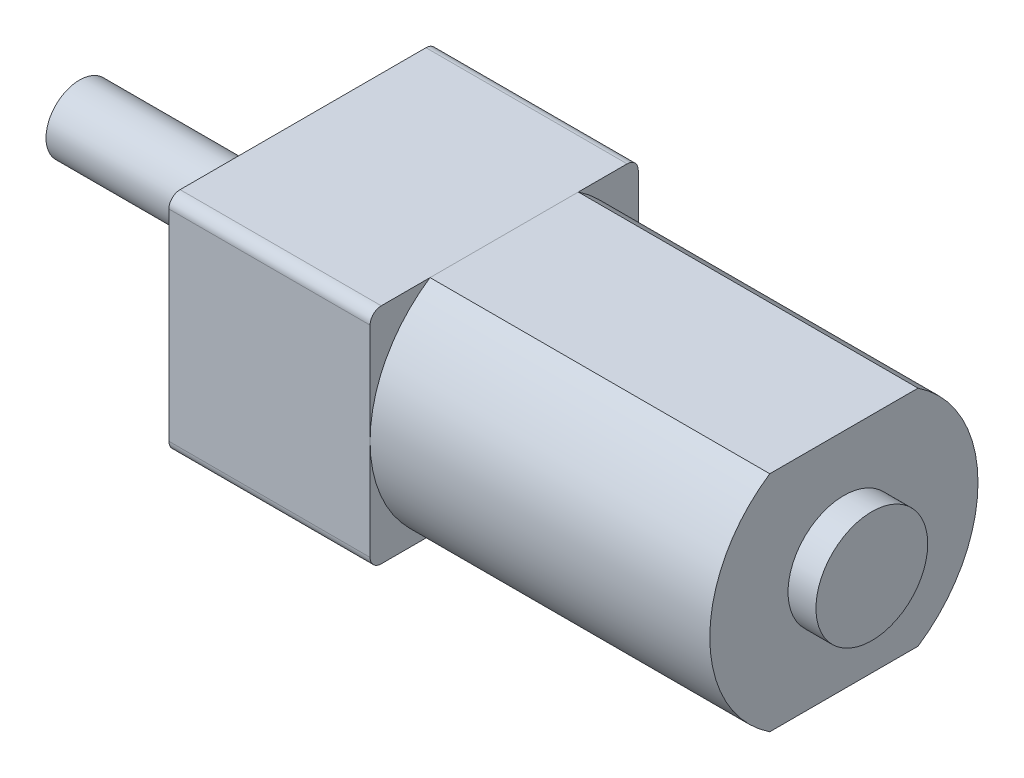
ISO-10303-21;
HEADER;
FILE_DESCRIPTION(('STEP AP214'),'2;1');
FILE_NAME('part.step','',(''),(''),'','','');
FILE_SCHEMA(('AUTOMOTIVE_DESIGN { 1 0 10303 214 1 1 1 1 }'));
ENDSEC;
DATA;
#1=APPLICATION_CONTEXT('core data for automotive mechanical design processes');
#2=APPLICATION_PROTOCOL_DEFINITION('international standard','automotive_design',2000,#1);
#3=PRODUCT_CONTEXT('',#1,'mechanical');
#4=PRODUCT('Part','Part','',(#3));
#5=PRODUCT_RELATED_PRODUCT_CATEGORY('part','',(#4));
#6=PRODUCT_DEFINITION_FORMATION('','',#4);
#7=PRODUCT_DEFINITION_CONTEXT('part definition',#1,'design');
#8=PRODUCT_DEFINITION('design','',#6,#7);
#9=PRODUCT_DEFINITION_SHAPE('','',#8);
#10=(LENGTH_UNIT() NAMED_UNIT(*) SI_UNIT(.MILLI.,.METRE.));
#11=(NAMED_UNIT(*) PLANE_ANGLE_UNIT() SI_UNIT($,.RADIAN.));
#12=(NAMED_UNIT(*) SI_UNIT($,.STERADIAN.) SOLID_ANGLE_UNIT());
#13=UNCERTAINTY_MEASURE_WITH_UNIT(LENGTH_MEASURE(1.E-05),#10,'distance_accuracy_value','');
#14=(GEOMETRIC_REPRESENTATION_CONTEXT(3) GLOBAL_UNCERTAINTY_ASSIGNED_CONTEXT((#13)) GLOBAL_UNIT_ASSIGNED_CONTEXT((#10,
#11,#12)) REPRESENTATION_CONTEXT('',''));
#15=CARTESIAN_POINT('',(0.,0.,0.));
#16=DIRECTION('',(0.,0.,1.));
#17=DIRECTION('',(1.,0.,0.));
#18=AXIS2_PLACEMENT_3D('',#15,#16,#17);
#19=CARTESIAN_POINT('',(-19.,0.,0.));
#20=DIRECTION('',(1.,0.,0.));
#21=DIRECTION('',(0.,0.,-1.));
#22=AXIS2_PLACEMENT_3D('',#19,#20,#21);
#23=CYLINDRICAL_SURFACE('',#22,1.5);
#24=CARTESIAN_POINT('',(-9.7,0.,0.));
#25=DIRECTION('',(-1.,0.,0.));
#26=DIRECTION('',(0.,0.,1.));
#27=AXIS2_PLACEMENT_3D('',#24,#25,#26);
#28=CIRCLE('',#27,1.5);
#29=CARTESIAN_POINT('',(-9.7,-1.,1.11803398874989));
#30=VERTEX_POINT('',#29);
#31=CARTESIAN_POINT('',(-9.7,-1.,-1.11803398874989));
#32=VERTEX_POINT('',#31);
#33=EDGE_CURVE('E74',#30,#32,#28,.T.);
#34=ORIENTED_EDGE('',*,*,#33,.T.);
#35=DIRECTION('',(1.,0.,0.));
#36=VECTOR('',#35,1.);
#37=CARTESIAN_POINT('',(-19.,-1.,-1.11803398874989));
#38=LINE('',#37,#36);
#39=CARTESIAN_POINT('',(-19.,-1.,-1.11803398874989));
#40=VERTEX_POINT('',#39);
#41=EDGE_CURVE('E12',#40,#32,#38,.T.);
#42=ORIENTED_EDGE('',*,*,#41,.F.);
#43=CARTESIAN_POINT('',(-19.,0.,0.));
#44=DIRECTION('',(-1.,0.,0.));
#45=DIRECTION('',(0.,0.,1.));
#46=AXIS2_PLACEMENT_3D('',#43,#44,#45);
#47=CIRCLE('',#46,1.5);
#48=CARTESIAN_POINT('',(-19.,-1.,1.11803398874989));
#49=VERTEX_POINT('',#48);
#50=EDGE_CURVE('E73',#49,#40,#47,.T.);
#51=ORIENTED_EDGE('',*,*,#50,.F.);
#52=DIRECTION('',(1.,0.,0.));
#53=VECTOR('',#52,1.);
#54=CARTESIAN_POINT('',(-19.,-1.,1.11803398874989));
#55=LINE('',#54,#53);
#56=EDGE_CURVE('E51',#49,#30,#55,.T.);
#57=ORIENTED_EDGE('',*,*,#56,.T.);
#58=EDGE_LOOP('',(#34,#42,#51,#57));
#59=FACE_BOUND('',#58,.T.);
#60=ADVANCED_FACE('F43',(#59),#23,.T.);
#61=CARTESIAN_POINT('',(-19.,-1.,-1.11803398874989));
#62=DIRECTION('',(0.,1.,0.));
#63=DIRECTION('',(0.,0.,1.));
#64=AXIS2_PLACEMENT_3D('',#61,#62,#63);
#65=PLANE('',#64);
#66=DIRECTION('',(0.,0.,1.));
#67=VECTOR('',#66,1.);
#68=CARTESIAN_POINT('',(-9.7,-1.,-1.11803398874989));
#69=LINE('',#68,#67);
#70=EDGE_CURVE('E66',#32,#30,#69,.T.);
#71=ORIENTED_EDGE('',*,*,#70,.T.);
#72=ORIENTED_EDGE('',*,*,#56,.F.);
#73=DIRECTION('',(0.,0.,1.));
#74=VECTOR('',#73,1.);
#75=CARTESIAN_POINT('',(-19.,-1.,-1.11803398874989));
#76=LINE('',#75,#74);
#77=EDGE_CURVE('E58',#40,#49,#76,.T.);
#78=ORIENTED_EDGE('',*,*,#77,.F.);
#79=ORIENTED_EDGE('',*,*,#41,.T.);
#80=EDGE_LOOP('',(#71,#72,#78,#79));
#81=FACE_BOUND('',#80,.T.);
#82=ADVANCED_FACE('F69',(#81),#65,.F.);
#83=CARTESIAN_POINT('',(-19.,0.,0.));
#84=DIRECTION('',(-1.,0.,0.));
#85=DIRECTION('',(0.,0.,1.));
#86=AXIS2_PLACEMENT_3D('',#83,#84,#85);
#87=PLANE('',#86);
#88=ORIENTED_EDGE('',*,*,#50,.T.);
#89=ORIENTED_EDGE('',*,*,#77,.T.);
#90=EDGE_LOOP('',(#88,#89));
#91=FACE_BOUND('',#90,.T.);
#92=ADVANCED_FACE('F81',(#91),#87,.T.);
#93=CARTESIAN_POINT('',(-9.7,0.,0.));
#94=DIRECTION('',(-1.,0.,0.));
#95=DIRECTION('',(0.,0.,1.));
#96=AXIS2_PLACEMENT_3D('',#93,#94,#95);
#97=PLANE('',#96);
#98=ORIENTED_EDGE('',*,*,#33,.F.);
#99=ORIENTED_EDGE('',*,*,#70,.F.);
#100=EDGE_LOOP('',(#98,#99));
#101=FACE_BOUND('',#100,.T.);
#102=ADVANCED_FACE('F77',(#101),#97,.F.);
#103=CLOSED_SHELL('',(#60,#82,#92,#102));
#104=MANIFOLD_SOLID_BREP('B2',#103);
#105=CARTESIAN_POINT('',(-9.7,0.,0.));
#106=DIRECTION('',(1.,0.,0.));
#107=DIRECTION('',(0.,0.,-1.));
#108=AXIS2_PLACEMENT_3D('',#105,#106,#107);
#109=CYLINDRICAL_SURFACE('',#108,2.);
#110=CARTESIAN_POINT('',(-9.7,0.,0.));
#111=DIRECTION('',(-1.,0.,0.));
#112=DIRECTION('',(0.,0.,1.));
#113=AXIS2_PLACEMENT_3D('',#110,#111,#112);
#114=CIRCLE('',#113,2.);
#115=CARTESIAN_POINT('',(-9.7,0.,2.));
#116=VERTEX_POINT('',#115);
#117=EDGE_CURVE('E42',#116,#116,#114,.T.);
#118=ORIENTED_EDGE('',*,*,#117,.F.);
#119=EDGE_LOOP('',(#118));
#120=FACE_BOUND('',#119,.T.);
#121=CARTESIAN_POINT('',(-9.,0.,0.));
#122=DIRECTION('',(-1.,0.,0.));
#123=DIRECTION('',(0.,0.,1.));
#124=AXIS2_PLACEMENT_3D('',#121,#122,#123);
#125=CIRCLE('',#124,2.);
#126=CARTESIAN_POINT('',(-9.,0.,2.));
#127=VERTEX_POINT('',#126);
#128=EDGE_CURVE('E127',#127,#127,#125,.T.);
#129=ORIENTED_EDGE('',*,*,#128,.T.);
#130=EDGE_LOOP('',(#129));
#131=FACE_BOUND('',#130,.T.);
#132=ADVANCED_FACE('F124',(#120,#131),#109,.T.);
#133=CARTESIAN_POINT('',(-9.7,0.,0.));
#134=DIRECTION('',(-1.,0.,0.));
#135=DIRECTION('',(0.,0.,1.));
#136=AXIS2_PLACEMENT_3D('',#133,#134,#135);
#137=PLANE('',#136);
#138=ORIENTED_EDGE('',*,*,#117,.T.);
#139=EDGE_LOOP('',(#138));
#140=FACE_BOUND('',#139,.T.);
#141=ADVANCED_FACE('F139',(#140),#137,.T.);
#142=CARTESIAN_POINT('',(-9.,0.,0.));
#143=DIRECTION('',(-1.,0.,0.));
#144=DIRECTION('',(0.,0.,1.));
#145=AXIS2_PLACEMENT_3D('',#142,#143,#144);
#146=PLANE('',#145);
#147=ORIENTED_EDGE('',*,*,#128,.F.);
#148=EDGE_LOOP('',(#147));
#149=FACE_BOUND('',#148,.T.);
#150=ADVANCED_FACE('F137',(#149),#146,.F.);
#151=CLOSED_SHELL('',(#132,#141,#150));
#152=MANIFOLD_SOLID_BREP('B6',#151);
#153=CARTESIAN_POINT('',(-9.,5.,6.));
#154=DIRECTION('',(0.,0.,-1.));
#155=DIRECTION('',(-1.,0.,0.));
#156=AXIS2_PLACEMENT_3D('',#153,#154,#155);
#157=PLANE('',#156);
#158=DIRECTION('',(0.,1.,0.));
#159=VECTOR('',#158,1.);
#160=CARTESIAN_POINT('',(-9.,5.,6.));
#161=LINE('',#160,#159);
#162=CARTESIAN_POINT('',(-9.,-4.5,6.));
#163=VERTEX_POINT('',#162);
#164=CARTESIAN_POINT('',(-9.,4.5,6.));
#165=VERTEX_POINT('',#164);
#166=EDGE_CURVE('E258',#163,#165,#161,.T.);
#167=ORIENTED_EDGE('',*,*,#166,.F.);
#168=DIRECTION('',(1.,0.,0.));
#169=VECTOR('',#168,1.);
#170=CARTESIAN_POINT('',(-9.,-4.5,6.));
#171=LINE('',#170,#169);
#172=CARTESIAN_POINT('',(0.,-4.5,6.));
#173=VERTEX_POINT('',#172);
#174=EDGE_CURVE('E243',#163,#173,#171,.T.);
#175=ORIENTED_EDGE('',*,*,#174,.T.);
#176=DIRECTION('',(0.,1.,0.));
#177=VECTOR('',#176,1.);
#178=CARTESIAN_POINT('',(0.,5.,6.));
#179=LINE('',#178,#177);
#180=CARTESIAN_POINT('',(0.,4.5,6.));
#181=VERTEX_POINT('',#180);
#182=EDGE_CURVE('E255',#173,#181,#179,.T.);
#183=ORIENTED_EDGE('',*,*,#182,.T.);
#184=DIRECTION('',(1.,0.,0.));
#185=VECTOR('',#184,1.);
#186=CARTESIAN_POINT('',(-9.,4.5,6.));
#187=LINE('',#186,#185);
#188=EDGE_CURVE('E260',#181,#165,#187,.F.);
#189=ORIENTED_EDGE('',*,*,#188,.T.);
#190=EDGE_LOOP('',(#167,#175,#183,#189));
#191=FACE_BOUND('',#190,.T.);
#192=ADVANCED_FACE('F173',(#191),#157,.F.);
#193=CARTESIAN_POINT('',(-9.,5.,-6.));
#194=DIRECTION('',(0.,-1.,0.));
#195=DIRECTION('',(0.,0.,-1.));
#196=AXIS2_PLACEMENT_3D('',#193,#194,#195);
#197=PLANE('',#196);
#198=DIRECTION('',(0.,0.,-1.));
#199=VECTOR('',#198,1.);
#200=CARTESIAN_POINT('',(0.,5.,-6.));
#201=LINE('',#200,#199);
#202=CARTESIAN_POINT('',(0.,5.,5.5));
#203=VERTEX_POINT('',#202);
#204=CARTESIAN_POINT('',(0.,5.,-5.5));
#205=VERTEX_POINT('',#204);
#206=EDGE_CURVE('E264',#203,#205,#201,.T.);
#207=ORIENTED_EDGE('',*,*,#206,.T.);
#208=DIRECTION('',(1.,0.,0.));
#209=VECTOR('',#208,1.);
#210=CARTESIAN_POINT('',(-9.,5.,-5.5));
#211=LINE('',#210,#209);
#212=CARTESIAN_POINT('',(-9.,5.,-5.5));
#213=VERTEX_POINT('',#212);
#214=EDGE_CURVE('E122',#205,#213,#211,.F.);
#215=ORIENTED_EDGE('',*,*,#214,.T.);
#216=DIRECTION('',(0.,0.,-1.));
#217=VECTOR('',#216,1.);
#218=CARTESIAN_POINT('',(-9.,5.,-6.));
#219=LINE('',#218,#217);
#220=CARTESIAN_POINT('',(-9.,5.,5.5));
#221=VERTEX_POINT('',#220);
#222=EDGE_CURVE('E300',#221,#213,#219,.T.);
#223=ORIENTED_EDGE('',*,*,#222,.F.);
#224=DIRECTION('',(1.,0.,0.));
#225=VECTOR('',#224,1.);
#226=CARTESIAN_POINT('',(-9.,5.,5.50000000000001));
#227=LINE('',#226,#225);
#228=EDGE_CURVE('E181',#221,#203,#227,.T.);
#229=ORIENTED_EDGE('',*,*,#228,.T.);
#230=EDGE_LOOP('',(#207,#215,#223,#229));
#231=FACE_BOUND('',#230,.T.);
#232=ADVANCED_FACE('F298',(#231),#197,.F.);
#233=CARTESIAN_POINT('',(-9.,5.,-6.));
#234=DIRECTION('',(0.,0.,1.));
#235=DIRECTION('',(0.,-1.,0.));
#236=AXIS2_PLACEMENT_3D('',#233,#234,#235);
#237=PLANE('',#236);
#238=DIRECTION('',(0.,-1.,0.));
#239=VECTOR('',#238,1.);
#240=CARTESIAN_POINT('',(0.,5.,-6.));
#241=LINE('',#240,#239);
#242=CARTESIAN_POINT('',(0.,4.5,-6.));
#243=VERTEX_POINT('',#242);
#244=CARTESIAN_POINT('',(0.,-4.5,-6.));
#245=VERTEX_POINT('',#244);
#246=EDGE_CURVE('E267',#243,#245,#241,.T.);
#247=ORIENTED_EDGE('',*,*,#246,.T.);
#248=DIRECTION('',(1.,0.,0.));
#249=VECTOR('',#248,1.);
#250=CARTESIAN_POINT('',(-9.,-4.5,-6.));
#251=LINE('',#250,#249);
#252=CARTESIAN_POINT('',(-9.,-4.5,-6.));
#253=VERTEX_POINT('',#252);
#254=EDGE_CURVE('E188',#245,#253,#251,.F.);
#255=ORIENTED_EDGE('',*,*,#254,.T.);
#256=DIRECTION('',(0.,-1.,0.));
#257=VECTOR('',#256,1.);
#258=CARTESIAN_POINT('',(-9.,5.,-6.));
#259=LINE('',#258,#257);
#260=CARTESIAN_POINT('',(-9.,4.5,-6.));
#261=VERTEX_POINT('',#260);
#262=EDGE_CURVE('E308',#261,#253,#259,.T.);
#263=ORIENTED_EDGE('',*,*,#262,.F.);
#264=DIRECTION('',(1.,0.,0.));
#265=VECTOR('',#264,1.);
#266=CARTESIAN_POINT('',(-9.,4.5,-6.));
#267=LINE('',#266,#265);
#268=EDGE_CURVE('E291',#261,#243,#267,.T.);
#269=ORIENTED_EDGE('',*,*,#268,.T.);
#270=EDGE_LOOP('',(#247,#255,#263,#269));
#271=FACE_BOUND('',#270,.T.);
#272=ADVANCED_FACE('F307',(#271),#237,.F.);
#273=CARTESIAN_POINT('',(-9.,-5.,-6.));
#274=DIRECTION('',(0.,1.,0.));
#275=DIRECTION('',(0.,0.,1.));
#276=AXIS2_PLACEMENT_3D('',#273,#274,#275);
#277=PLANE('',#276);
#278=DIRECTION('',(0.,0.,1.));
#279=VECTOR('',#278,1.);
#280=CARTESIAN_POINT('',(0.,-5.,-6.));
#281=LINE('',#280,#279);
#282=CARTESIAN_POINT('',(0.,-5.,-5.5));
#283=VERTEX_POINT('',#282);
#284=CARTESIAN_POINT('',(0.,-5.,5.50000000000001));
#285=VERTEX_POINT('',#284);
#286=EDGE_CURVE('E274',#283,#285,#281,.T.);
#287=ORIENTED_EDGE('',*,*,#286,.T.);
#288=DIRECTION('',(1.,0.,0.));
#289=VECTOR('',#288,1.);
#290=CARTESIAN_POINT('',(-9.,-5.,5.50000000000001));
#291=LINE('',#290,#289);
#292=CARTESIAN_POINT('',(-9.,-5.,5.50000000000001));
#293=VERTEX_POINT('',#292);
#294=EDGE_CURVE('E244',#285,#293,#291,.F.);
#295=ORIENTED_EDGE('',*,*,#294,.T.);
#296=DIRECTION('',(0.,0.,1.));
#297=VECTOR('',#296,1.);
#298=CARTESIAN_POINT('',(-9.,-5.,-6.));
#299=LINE('',#298,#297);
#300=CARTESIAN_POINT('',(-9.,-5.,-5.5));
#301=VERTEX_POINT('',#300);
#302=EDGE_CURVE('E270',#301,#293,#299,.T.);
#303=ORIENTED_EDGE('',*,*,#302,.F.);
#304=DIRECTION('',(1.,0.,0.));
#305=VECTOR('',#304,1.);
#306=CARTESIAN_POINT('',(-9.,-5.,-5.5));
#307=LINE('',#306,#305);
#308=EDGE_CURVE('E249',#301,#283,#307,.T.);
#309=ORIENTED_EDGE('',*,*,#308,.T.);
#310=EDGE_LOOP('',(#287,#295,#303,#309));
#311=FACE_BOUND('',#310,.T.);
#312=ADVANCED_FACE('F336',(#311),#277,.F.);
#313=CARTESIAN_POINT('',(-9.,0.,0.));
#314=DIRECTION('',(-1.,0.,0.));
#315=DIRECTION('',(0.,0.,1.));
#316=AXIS2_PLACEMENT_3D('',#313,#314,#315);
#317=PLANE('',#316);
#318=ORIENTED_EDGE('',*,*,#302,.T.);
#319=CARTESIAN_POINT('',(-9.,-4.5,5.50000000000001));
#320=DIRECTION('',(-1.,0.,0.));
#321=DIRECTION('',(0.,0.,1.));
#322=AXIS2_PLACEMENT_3D('',#319,#320,#321);
#323=CIRCLE('',#322,0.499999999999997);
#324=EDGE_CURVE('E289',#293,#163,#323,.T.);
#325=ORIENTED_EDGE('',*,*,#324,.T.);
#326=ORIENTED_EDGE('',*,*,#166,.T.);
#327=CARTESIAN_POINT('',(-9.,4.5,5.50000000000001));
#328=DIRECTION('',(-1.,0.,0.));
#329=DIRECTION('',(0.,0.,1.));
#330=AXIS2_PLACEMENT_3D('',#327,#328,#329);
#331=CIRCLE('',#330,0.499999999999997);
#332=EDGE_CURVE('E284',#165,#221,#331,.T.);
#333=ORIENTED_EDGE('',*,*,#332,.T.);
#334=ORIENTED_EDGE('',*,*,#222,.T.);
#335=CARTESIAN_POINT('',(-9.,4.5,-5.5));
#336=DIRECTION('',(-1.,0.,0.));
#337=DIRECTION('',(0.,0.,1.));
#338=AXIS2_PLACEMENT_3D('',#335,#336,#337);
#339=CIRCLE('',#338,0.499999999999997);
#340=EDGE_CURVE('E195',#213,#261,#339,.T.);
#341=ORIENTED_EDGE('',*,*,#340,.T.);
#342=ORIENTED_EDGE('',*,*,#262,.T.);
#343=CARTESIAN_POINT('',(-9.,-4.5,-5.5));
#344=DIRECTION('',(-1.,0.,0.));
#345=DIRECTION('',(0.,0.,1.));
#346=AXIS2_PLACEMENT_3D('',#343,#344,#345);
#347=CIRCLE('',#346,0.499999999999997);
#348=EDGE_CURVE('E287',#253,#301,#347,.T.);
#349=ORIENTED_EDGE('',*,*,#348,.T.);
#350=EDGE_LOOP('',(#318,#325,#326,#333,#334,#341,#342,#349));
#351=FACE_BOUND('',#350,.T.);
#352=ADVANCED_FACE('F313',(#351),#317,.T.);
#353=CARTESIAN_POINT('',(0.,0.,0.));
#354=DIRECTION('',(-1.,0.,0.));
#355=DIRECTION('',(0.,0.,1.));
#356=AXIS2_PLACEMENT_3D('',#353,#354,#355);
#357=PLANE('',#356);
#358=ORIENTED_EDGE('',*,*,#182,.F.);
#359=CARTESIAN_POINT('',(0.,-4.5,5.50000000000001));
#360=DIRECTION('',(-1.,0.,0.));
#361=DIRECTION('',(0.,0.,1.));
#362=AXIS2_PLACEMENT_3D('',#359,#360,#361);
#363=CIRCLE('',#362,0.499999999999997);
#364=EDGE_CURVE('E239',#173,#285,#363,.F.);
#365=ORIENTED_EDGE('',*,*,#364,.T.);
#366=ORIENTED_EDGE('',*,*,#286,.F.);
#367=CARTESIAN_POINT('',(0.,-4.5,-5.5));
#368=DIRECTION('',(-1.,0.,0.));
#369=DIRECTION('',(0.,0.,1.));
#370=AXIS2_PLACEMENT_3D('',#367,#368,#369);
#371=CIRCLE('',#370,0.499999999999997);
#372=EDGE_CURVE('E250',#283,#245,#371,.F.);
#373=ORIENTED_EDGE('',*,*,#372,.T.);
#374=ORIENTED_EDGE('',*,*,#246,.F.);
#375=CARTESIAN_POINT('',(0.,4.5,-5.5));
#376=DIRECTION('',(-1.,0.,0.));
#377=DIRECTION('',(0.,0.,1.));
#378=AXIS2_PLACEMENT_3D('',#375,#376,#377);
#379=CIRCLE('',#378,0.499999999999997);
#380=EDGE_CURVE('E278',#243,#205,#379,.F.);
#381=ORIENTED_EDGE('',*,*,#380,.T.);
#382=ORIENTED_EDGE('',*,*,#206,.F.);
#383=CARTESIAN_POINT('',(0.,4.5,5.50000000000001));
#384=DIRECTION('',(-1.,0.,0.));
#385=DIRECTION('',(0.,0.,1.));
#386=AXIS2_PLACEMENT_3D('',#383,#384,#385);
#387=CIRCLE('',#386,0.499999999999997);
#388=EDGE_CURVE('E259',#203,#181,#387,.F.);
#389=ORIENTED_EDGE('',*,*,#388,.T.);
#390=EDGE_LOOP('',(#358,#365,#366,#373,#374,#381,#382,#389));
#391=FACE_BOUND('',#390,.T.);
#392=ADVANCED_FACE('F262',(#391),#357,.F.);
#393=CARTESIAN_POINT('',(-9.,-4.5,5.50000000000001));
#394=DIRECTION('',(1.,0.,0.));
#395=DIRECTION('',(0.,0.,-1.));
#396=AXIS2_PLACEMENT_3D('',#393,#394,#395);
#397=CYLINDRICAL_SURFACE('',#396,0.499999999999997);
#398=ORIENTED_EDGE('',*,*,#324,.F.);
#399=ORIENTED_EDGE('',*,*,#294,.F.);
#400=ORIENTED_EDGE('',*,*,#364,.F.);
#401=ORIENTED_EDGE('',*,*,#174,.F.);
#402=EDGE_LOOP('',(#398,#399,#400,#401));
#403=FACE_BOUND('',#402,.T.);
#404=ADVANCED_FACE('F242',(#403),#397,.T.);
#405=CARTESIAN_POINT('',(-9.,-4.5,-5.5));
#406=DIRECTION('',(1.,0.,0.));
#407=DIRECTION('',(0.,0.,-1.));
#408=AXIS2_PLACEMENT_3D('',#405,#406,#407);
#409=CYLINDRICAL_SURFACE('',#408,0.499999999999997);
#410=ORIENTED_EDGE('',*,*,#348,.F.);
#411=ORIENTED_EDGE('',*,*,#254,.F.);
#412=ORIENTED_EDGE('',*,*,#372,.F.);
#413=ORIENTED_EDGE('',*,*,#308,.F.);
#414=EDGE_LOOP('',(#410,#411,#412,#413));
#415=FACE_BOUND('',#414,.T.);
#416=ADVANCED_FACE('F318',(#415),#409,.T.);
#417=CARTESIAN_POINT('',(-9.,4.5,-5.5));
#418=DIRECTION('',(1.,0.,0.));
#419=DIRECTION('',(0.,0.,-1.));
#420=AXIS2_PLACEMENT_3D('',#417,#418,#419);
#421=CYLINDRICAL_SURFACE('',#420,0.499999999999997);
#422=ORIENTED_EDGE('',*,*,#340,.F.);
#423=ORIENTED_EDGE('',*,*,#214,.F.);
#424=ORIENTED_EDGE('',*,*,#380,.F.);
#425=ORIENTED_EDGE('',*,*,#268,.F.);
#426=EDGE_LOOP('',(#422,#423,#424,#425));
#427=FACE_BOUND('',#426,.T.);
#428=ADVANCED_FACE('F306',(#427),#421,.T.);
#429=CARTESIAN_POINT('',(-9.,4.5,5.50000000000001));
#430=DIRECTION('',(1.,0.,0.));
#431=DIRECTION('',(0.,0.,-1.));
#432=AXIS2_PLACEMENT_3D('',#429,#430,#431);
#433=CYLINDRICAL_SURFACE('',#432,0.499999999999997);
#434=ORIENTED_EDGE('',*,*,#332,.F.);
#435=ORIENTED_EDGE('',*,*,#188,.F.);
#436=ORIENTED_EDGE('',*,*,#388,.F.);
#437=ORIENTED_EDGE('',*,*,#228,.F.);
#438=EDGE_LOOP('',(#434,#435,#436,#437));
#439=FACE_BOUND('',#438,.T.);
#440=ADVANCED_FACE('F175',(#439),#433,.T.);
#441=CLOSED_SHELL('',(#192,#232,#272,#312,#352,#392,#404,#416,#428,#440));
#442=MANIFOLD_SOLID_BREP('B37',#441);
#443=CARTESIAN_POINT('',(15.2,0.,0.));
#444=DIRECTION('',(1.,0.,0.));
#445=DIRECTION('',(0.,0.,-1.));
#446=AXIS2_PLACEMENT_3D('',#443,#444,#445);
#447=PLANE('',#446);
#448=CARTESIAN_POINT('',(15.2,0.,0.));
#449=DIRECTION('',(1.,0.,0.));
#450=DIRECTION('',(0.,0.,-1.));
#451=AXIS2_PLACEMENT_3D('',#448,#449,#450);
#452=CIRCLE('',#451,6.);
#453=CARTESIAN_POINT('',(15.2,5.,3.3166247903554));
#454=VERTEX_POINT('',#453);
#455=CARTESIAN_POINT('',(15.2,-5.,3.31662479035541));
#456=VERTEX_POINT('',#455);
#457=EDGE_CURVE('E452',#454,#456,#452,.T.);
#458=ORIENTED_EDGE('',*,*,#457,.T.);
#459=DIRECTION('',(0.,0.,-1.));
#460=VECTOR('',#459,1.);
#461=CARTESIAN_POINT('',(15.2,-5.,3.31662479035541));
#462=LINE('',#461,#460);
#463=CARTESIAN_POINT('',(15.2,-5.,-3.31662479035539));
#464=VERTEX_POINT('',#463);
#465=EDGE_CURVE('E447',#456,#464,#462,.T.);
#466=ORIENTED_EDGE('',*,*,#465,.T.);
#467=CARTESIAN_POINT('',(15.2,0.,0.));
#468=DIRECTION('',(1.,0.,0.));
#469=DIRECTION('',(0.,0.,-1.));
#470=AXIS2_PLACEMENT_3D('',#467,#468,#469);
#471=CIRCLE('',#470,6.);
#472=CARTESIAN_POINT('',(15.2,5.,-3.3166247903554));
#473=VERTEX_POINT('',#472);
#474=EDGE_CURVE('E450',#464,#473,#471,.T.);
#475=ORIENTED_EDGE('',*,*,#474,.T.);
#476=DIRECTION('',(0.,0.,1.));
#477=VECTOR('',#476,1.);
#478=CARTESIAN_POINT('',(15.2,5.,3.3166247903554));
#479=LINE('',#478,#477);
#480=EDGE_CURVE('E417',#473,#454,#479,.T.);
#481=ORIENTED_EDGE('',*,*,#480,.T.);
#482=EDGE_LOOP('',(#458,#466,#475,#481));
#483=FACE_BOUND('',#482,.T.);
#484=CARTESIAN_POINT('',(15.2,0.,0.));
#485=DIRECTION('',(1.,0.,0.));
#486=DIRECTION('',(0.,0.,-1.));
#487=AXIS2_PLACEMENT_3D('',#484,#485,#486);
#488=CIRCLE('',#487,2.5);
#489=CARTESIAN_POINT('',(15.2,0.,-2.5));
#490=VERTEX_POINT('',#489);
#491=EDGE_CURVE('E478',#490,#490,#488,.T.);
#492=ORIENTED_EDGE('',*,*,#491,.F.);
#493=EDGE_LOOP('',(#492));
#494=FACE_BOUND('',#493,.T.);
#495=ADVANCED_FACE('F400',(#483,#494),#447,.T.);
#496=CARTESIAN_POINT('',(15.2,0.,0.));
#497=DIRECTION('',(-1.,0.,0.));
#498=DIRECTION('',(0.,0.,1.));
#499=AXIS2_PLACEMENT_3D('',#496,#497,#498);
#500=CYLINDRICAL_SURFACE('',#499,6.);
#501=CARTESIAN_POINT('',(0.,0.,0.));
#502=DIRECTION('',(1.,0.,0.));
#503=DIRECTION('',(0.,0.,-1.));
#504=AXIS2_PLACEMENT_3D('',#501,#502,#503);
#505=CIRCLE('',#504,6.);
#506=CARTESIAN_POINT('',(0.,5.,3.3166247903554));
#507=VERTEX_POINT('',#506);
#508=CARTESIAN_POINT('',(0.,-5.,3.31662479035541));
#509=VERTEX_POINT('',#508);
#510=EDGE_CURVE('E464',#507,#509,#505,.T.);
#511=ORIENTED_EDGE('',*,*,#510,.T.);
#512=DIRECTION('',(-1.,0.,0.));
#513=VECTOR('',#512,1.);
#514=CARTESIAN_POINT('',(15.2,-5.,3.31662479035541));
#515=LINE('',#514,#513);
#516=EDGE_CURVE('E171',#456,#509,#515,.T.);
#517=ORIENTED_EDGE('',*,*,#516,.F.);
#518=ORIENTED_EDGE('',*,*,#457,.F.);
#519=DIRECTION('',(-1.,0.,0.));
#520=VECTOR('',#519,1.);
#521=CARTESIAN_POINT('',(15.2,5.,3.3166247903554));
#522=LINE('',#521,#520);
#523=EDGE_CURVE('E460',#454,#507,#522,.T.);
#524=ORIENTED_EDGE('',*,*,#523,.T.);
#525=EDGE_LOOP('',(#511,#517,#518,#524));
#526=FACE_BOUND('',#525,.T.);
#527=ADVANCED_FACE('F402',(#526),#500,.T.);
#528=CARTESIAN_POINT('',(15.2,-5.,3.31662479035541));
#529=DIRECTION('',(0.,1.,0.));
#530=DIRECTION('',(0.,0.,1.));
#531=AXIS2_PLACEMENT_3D('',#528,#529,#530);
#532=PLANE('',#531);
#533=DIRECTION('',(0.,0.,-1.));
#534=VECTOR('',#533,1.);
#535=CARTESIAN_POINT('',(0.,-5.,3.31662479035541));
#536=LINE('',#535,#534);
#537=CARTESIAN_POINT('',(0.,-5.,-3.31662479035539));
#538=VERTEX_POINT('',#537);
#539=EDGE_CURVE('E456',#509,#538,#536,.T.);
#540=ORIENTED_EDGE('',*,*,#539,.T.);
#541=DIRECTION('',(-1.,0.,0.));
#542=VECTOR('',#541,1.);
#543=CARTESIAN_POINT('',(15.2,-5.,-3.31662479035539));
#544=LINE('',#543,#542);
#545=EDGE_CURVE('E409',#464,#538,#544,.T.);
#546=ORIENTED_EDGE('',*,*,#545,.F.);
#547=ORIENTED_EDGE('',*,*,#465,.F.);
#548=ORIENTED_EDGE('',*,*,#516,.T.);
#549=EDGE_LOOP('',(#540,#546,#547,#548));
#550=FACE_BOUND('',#549,.T.);
#551=ADVANCED_FACE('F455',(#550),#532,.F.);
#552=CARTESIAN_POINT('',(15.2,0.,0.));
#553=DIRECTION('',(-1.,0.,0.));
#554=DIRECTION('',(0.,0.,1.));
#555=AXIS2_PLACEMENT_3D('',#552,#553,#554);
#556=CYLINDRICAL_SURFACE('',#555,6.);
#557=CARTESIAN_POINT('',(0.,0.,0.));
#558=DIRECTION('',(1.,0.,0.));
#559=DIRECTION('',(0.,0.,-1.));
#560=AXIS2_PLACEMENT_3D('',#557,#558,#559);
#561=CIRCLE('',#560,6.);
#562=CARTESIAN_POINT('',(0.,5.,-3.3166247903554));
#563=VERTEX_POINT('',#562);
#564=EDGE_CURVE('E434',#538,#563,#561,.T.);
#565=ORIENTED_EDGE('',*,*,#564,.T.);
#566=DIRECTION('',(-1.,0.,0.));
#567=VECTOR('',#566,1.);
#568=CARTESIAN_POINT('',(15.2,5.,-3.3166247903554));
#569=LINE('',#568,#567);
#570=EDGE_CURVE('E457',#473,#563,#569,.T.);
#571=ORIENTED_EDGE('',*,*,#570,.F.);
#572=ORIENTED_EDGE('',*,*,#474,.F.);
#573=ORIENTED_EDGE('',*,*,#545,.T.);
#574=EDGE_LOOP('',(#565,#571,#572,#573));
#575=FACE_BOUND('',#574,.T.);
#576=ADVANCED_FACE('F458',(#575),#556,.T.);
#577=CARTESIAN_POINT('',(15.2,5.,3.3166247903554));
#578=DIRECTION('',(0.,-1.,0.));
#579=DIRECTION('',(0.,0.,-1.));
#580=AXIS2_PLACEMENT_3D('',#577,#578,#579);
#581=PLANE('',#580);
#582=DIRECTION('',(0.,0.,1.));
#583=VECTOR('',#582,1.);
#584=CARTESIAN_POINT('',(0.,5.,3.3166247903554));
#585=LINE('',#584,#583);
#586=EDGE_CURVE('E440',#563,#507,#585,.T.);
#587=ORIENTED_EDGE('',*,*,#586,.T.);
#588=ORIENTED_EDGE('',*,*,#523,.F.);
#589=ORIENTED_EDGE('',*,*,#480,.F.);
#590=ORIENTED_EDGE('',*,*,#570,.T.);
#591=EDGE_LOOP('',(#587,#588,#589,#590));
#592=FACE_BOUND('',#591,.T.);
#593=ADVANCED_FACE('F472',(#592),#581,.F.);
#594=CARTESIAN_POINT('',(0.,0.,0.));
#595=DIRECTION('',(1.,0.,0.));
#596=DIRECTION('',(0.,0.,-1.));
#597=AXIS2_PLACEMENT_3D('',#594,#595,#596);
#598=PLANE('',#597);
#599=ORIENTED_EDGE('',*,*,#510,.F.);
#600=ORIENTED_EDGE('',*,*,#586,.F.);
#601=ORIENTED_EDGE('',*,*,#564,.F.);
#602=ORIENTED_EDGE('',*,*,#539,.F.);
#603=EDGE_LOOP('',(#599,#600,#601,#602));
#604=FACE_BOUND('',#603,.T.);
#605=ADVANCED_FACE('F475',(#604),#598,.F.);
#606=CARTESIAN_POINT('',(16.45,0.,0.));
#607=DIRECTION('',(-1.,0.,0.));
#608=DIRECTION('',(0.,0.,1.));
#609=AXIS2_PLACEMENT_3D('',#606,#607,#608);
#610=CYLINDRICAL_SURFACE('',#609,2.5);
#611=CARTESIAN_POINT('',(16.45,0.,0.));
#612=DIRECTION('',(1.,0.,0.));
#613=DIRECTION('',(0.,0.,-1.));
#614=AXIS2_PLACEMENT_3D('',#611,#612,#613);
#615=CIRCLE('',#614,2.5);
#616=CARTESIAN_POINT('',(16.45,0.,-2.5));
#617=VERTEX_POINT('',#616);
#618=EDGE_CURVE('E467',#617,#617,#615,.T.);
#619=ORIENTED_EDGE('',*,*,#618,.F.);
#620=EDGE_LOOP('',(#619));
#621=FACE_BOUND('',#620,.T.);
#622=ORIENTED_EDGE('',*,*,#491,.T.);
#623=EDGE_LOOP('',(#622));
#624=FACE_BOUND('',#623,.T.);
#625=ADVANCED_FACE('F486',(#621,#624),#610,.T.);
#626=CARTESIAN_POINT('',(16.45,0.,0.));
#627=DIRECTION('',(1.,0.,0.));
#628=DIRECTION('',(0.,0.,-1.));
#629=AXIS2_PLACEMENT_3D('',#626,#627,#628);
#630=PLANE('',#629);
#631=ORIENTED_EDGE('',*,*,#618,.T.);
#632=EDGE_LOOP('',(#631));
#633=FACE_BOUND('',#632,.T.);
#634=ADVANCED_FACE('F484',(#633),#630,.T.);
#635=CLOSED_SHELL('',(#495,#527,#551,#576,#593,#605,#625,#634));
#636=MANIFOLD_SOLID_BREP('B116',#635);
#637=ADVANCED_BREP_SHAPE_REPRESENTATION('',(#18,#104,#152,#442,#636),#14);
#638=SHAPE_DEFINITION_REPRESENTATION(#9,#637);
ENDSEC;
END-ISO-10303-21;
